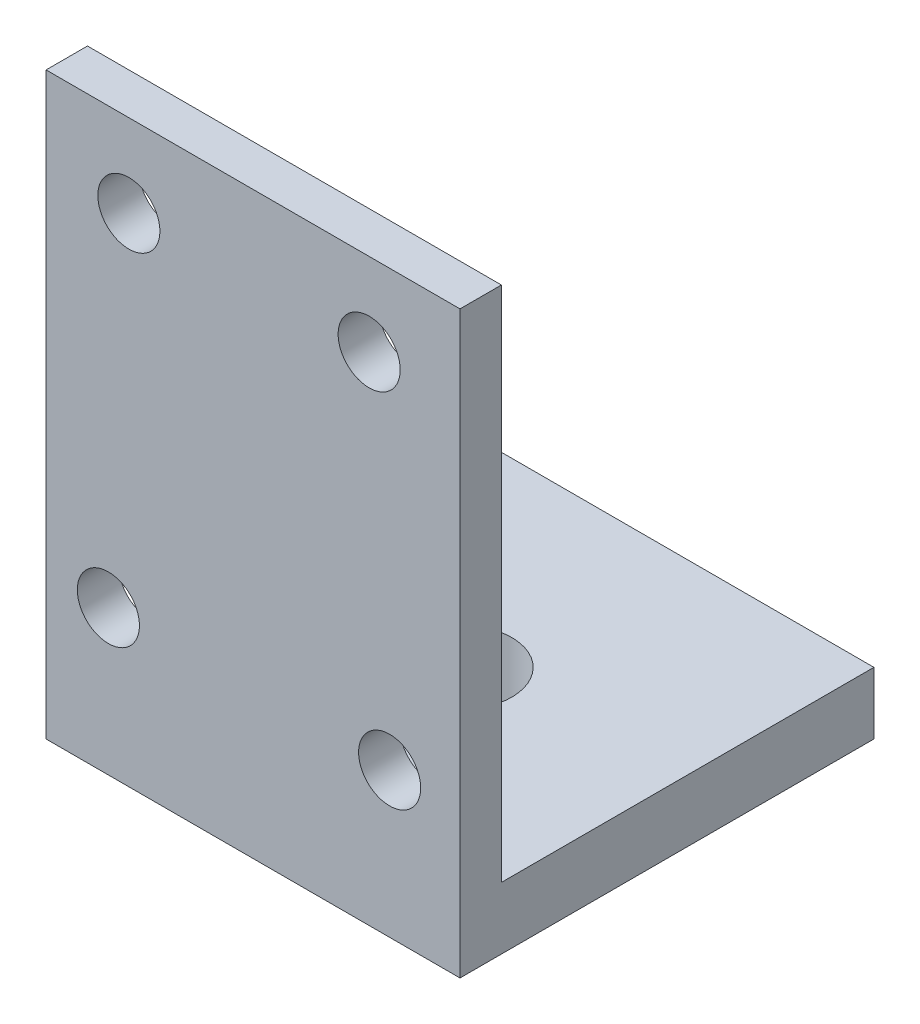
ISO-10303-21;
HEADER;
FILE_DESCRIPTION(('STEP AP214'),'2;1');
FILE_NAME('part.step','',(''),(''),'','','');
FILE_SCHEMA(('AUTOMOTIVE_DESIGN { 1 0 10303 214 1 1 1 1 }'));
ENDSEC;
DATA;
#1=APPLICATION_CONTEXT('core data for automotive mechanical design processes');
#2=APPLICATION_PROTOCOL_DEFINITION('international standard','automotive_design',2000,#1);
#3=PRODUCT_CONTEXT('',#1,'mechanical');
#4=PRODUCT('Part','Part','',(#3));
#5=PRODUCT_RELATED_PRODUCT_CATEGORY('part','',(#4));
#6=PRODUCT_DEFINITION_FORMATION('','',#4);
#7=PRODUCT_DEFINITION_CONTEXT('part definition',#1,'design');
#8=PRODUCT_DEFINITION('design','',#6,#7);
#9=PRODUCT_DEFINITION_SHAPE('','',#8);
#10=(LENGTH_UNIT() NAMED_UNIT(*) SI_UNIT(.MILLI.,.METRE.));
#11=(NAMED_UNIT(*) PLANE_ANGLE_UNIT() SI_UNIT($,.RADIAN.));
#12=(NAMED_UNIT(*) SI_UNIT($,.STERADIAN.) SOLID_ANGLE_UNIT());
#13=UNCERTAINTY_MEASURE_WITH_UNIT(LENGTH_MEASURE(1.E-05),#10,'distance_accuracy_value','');
#14=(GEOMETRIC_REPRESENTATION_CONTEXT(3) GLOBAL_UNCERTAINTY_ASSIGNED_CONTEXT((#13)) GLOBAL_UNIT_ASSIGNED_CONTEXT((#10,
#11,#12)) REPRESENTATION_CONTEXT('',''));
#15=CARTESIAN_POINT('',(0.,0.,0.));
#16=DIRECTION('',(0.,0.,1.));
#17=DIRECTION('',(1.,0.,0.));
#18=AXIS2_PLACEMENT_3D('',#15,#16,#17);
#19=CARTESIAN_POINT('',(0.,3.,0.));
#20=DIRECTION('',(0.,-1.,0.));
#21=DIRECTION('',(0.,0.,-1.));
#22=AXIS2_PLACEMENT_3D('',#19,#20,#21);
#23=PLANE('',#22);
#24=CARTESIAN_POINT('',(10.,3.,-10.));
#25=DIRECTION('',(0.,1.,0.));
#26=DIRECTION('',(0.,0.,1.));
#27=AXIS2_PLACEMENT_3D('',#24,#25,#26);
#28=CIRCLE('',#27,2.5);
#29=CARTESIAN_POINT('',(10.,3.,-7.5));
#30=VERTEX_POINT('',#29);
#31=EDGE_CURVE('E107',#30,#30,#28,.T.);
#32=ORIENTED_EDGE('',*,*,#31,.F.);
#33=EDGE_LOOP('',(#32));
#34=FACE_BOUND('',#33,.T.);
#35=DIRECTION('',(-1.,0.,0.));
#36=VECTOR('',#35,1.);
#37=CARTESIAN_POINT('',(0.,3.,-2.));
#38=LINE('',#37,#36);
#39=CARTESIAN_POINT('',(20.,3.,-2.));
#40=VERTEX_POINT('',#39);
#41=CARTESIAN_POINT('',(0.,3.,-2.));
#42=VERTEX_POINT('',#41);
#43=EDGE_CURVE('E57',#40,#42,#38,.T.);
#44=ORIENTED_EDGE('',*,*,#43,.F.);
#45=DIRECTION('',(0.,0.,-1.));
#46=VECTOR('',#45,1.);
#47=CARTESIAN_POINT('',(20.,3.,0.));
#48=LINE('',#47,#46);
#49=CARTESIAN_POINT('',(20.,3.,-20.));
#50=VERTEX_POINT('',#49);
#51=EDGE_CURVE('E167',#40,#50,#48,.T.);
#52=ORIENTED_EDGE('',*,*,#51,.T.);
#53=DIRECTION('',(-1.,0.,0.));
#54=VECTOR('',#53,1.);
#55=CARTESIAN_POINT('',(0.,3.,-20.));
#56=LINE('',#55,#54);
#57=CARTESIAN_POINT('',(0.,3.,-20.));
#58=VERTEX_POINT('',#57);
#59=EDGE_CURVE('E63',#50,#58,#56,.T.);
#60=ORIENTED_EDGE('',*,*,#59,.T.);
#61=DIRECTION('',(0.,0.,1.));
#62=VECTOR('',#61,1.);
#63=CARTESIAN_POINT('',(0.,3.,0.));
#64=LINE('',#63,#62);
#65=EDGE_CURVE('E93',#58,#42,#64,.T.);
#66=ORIENTED_EDGE('',*,*,#65,.T.);
#67=EDGE_LOOP('',(#44,#52,#60,#66));
#68=FACE_BOUND('',#67,.T.);
#69=ADVANCED_FACE('F39',(#34,#68),#23,.F.);
#70=CARTESIAN_POINT('',(0.,0.,0.));
#71=DIRECTION('',(0.,-1.,0.));
#72=DIRECTION('',(0.,0.,-1.));
#73=AXIS2_PLACEMENT_3D('',#70,#71,#72);
#74=PLANE('',#73);
#75=DIRECTION('',(0.,0.,1.));
#76=VECTOR('',#75,1.);
#77=CARTESIAN_POINT('',(0.,0.,0.));
#78=LINE('',#77,#76);
#79=CARTESIAN_POINT('',(0.,0.,-20.));
#80=VERTEX_POINT('',#79);
#81=CARTESIAN_POINT('',(0.,0.,0.));
#82=VERTEX_POINT('',#81);
#83=EDGE_CURVE('E99',#80,#82,#78,.T.);
#84=ORIENTED_EDGE('',*,*,#83,.F.);
#85=DIRECTION('',(-1.,0.,0.));
#86=VECTOR('',#85,1.);
#87=CARTESIAN_POINT('',(0.,0.,-20.));
#88=LINE('',#87,#86);
#89=CARTESIAN_POINT('',(20.,0.,-20.));
#90=VERTEX_POINT('',#89);
#91=EDGE_CURVE('E82',#90,#80,#88,.T.);
#92=ORIENTED_EDGE('',*,*,#91,.F.);
#93=DIRECTION('',(0.,0.,-1.));
#94=VECTOR('',#93,1.);
#95=CARTESIAN_POINT('',(20.,0.,0.));
#96=LINE('',#95,#94);
#97=CARTESIAN_POINT('',(20.,0.,0.));
#98=VERTEX_POINT('',#97);
#99=EDGE_CURVE('E94',#98,#90,#96,.T.);
#100=ORIENTED_EDGE('',*,*,#99,.F.);
#101=DIRECTION('',(1.,0.,0.));
#102=VECTOR('',#101,1.);
#103=CARTESIAN_POINT('',(0.,0.,0.));
#104=LINE('',#103,#102);
#105=EDGE_CURVE('E105',#82,#98,#104,.T.);
#106=ORIENTED_EDGE('',*,*,#105,.F.);
#107=EDGE_LOOP('',(#84,#92,#100,#106));
#108=FACE_BOUND('',#107,.T.);
#109=CARTESIAN_POINT('',(10.,0.,-10.));
#110=DIRECTION('',(0.,1.,0.));
#111=DIRECTION('',(0.,0.,1.));
#112=AXIS2_PLACEMENT_3D('',#109,#110,#111);
#113=CIRCLE('',#112,2.5);
#114=CARTESIAN_POINT('',(10.,0.,-7.5));
#115=VERTEX_POINT('',#114);
#116=EDGE_CURVE('E113',#115,#115,#113,.T.);
#117=ORIENTED_EDGE('',*,*,#116,.T.);
#118=EDGE_LOOP('',(#117));
#119=FACE_BOUND('',#118,.T.);
#120=ADVANCED_FACE('F103',(#108,#119),#74,.T.);
#121=CARTESIAN_POINT('',(0.,3.,0.));
#122=DIRECTION('',(1.,0.,0.));
#123=DIRECTION('',(0.,0.,-1.));
#124=AXIS2_PLACEMENT_3D('',#121,#122,#123);
#125=PLANE('',#124);
#126=ORIENTED_EDGE('',*,*,#83,.T.);
#127=DIRECTION('',(0.,-1.,0.));
#128=VECTOR('',#127,1.);
#129=CARTESIAN_POINT('',(0.,3.,0.));
#130=LINE('',#129,#128);
#131=CARTESIAN_POINT('',(0.,28.,0.));
#132=VERTEX_POINT('',#131);
#133=EDGE_CURVE('E11',#132,#82,#130,.T.);
#134=ORIENTED_EDGE('',*,*,#133,.F.);
#135=DIRECTION('',(0.,0.,1.));
#136=VECTOR('',#135,1.);
#137=CARTESIAN_POINT('',(0.,28.,0.));
#138=LINE('',#137,#136);
#139=CARTESIAN_POINT('',(0.,28.,-2.));
#140=VERTEX_POINT('',#139);
#141=EDGE_CURVE('E143',#140,#132,#138,.T.);
#142=ORIENTED_EDGE('',*,*,#141,.F.);
#143=DIRECTION('',(0.,-1.,0.));
#144=VECTOR('',#143,1.);
#145=CARTESIAN_POINT('',(0.,28.,-2.));
#146=LINE('',#145,#144);
#147=EDGE_CURVE('E157',#140,#42,#146,.T.);
#148=ORIENTED_EDGE('',*,*,#147,.T.);
#149=ORIENTED_EDGE('',*,*,#65,.F.);
#150=DIRECTION('',(0.,-1.,0.));
#151=VECTOR('',#150,1.);
#152=CARTESIAN_POINT('',(0.,3.,-20.));
#153=LINE('',#152,#151);
#154=EDGE_CURVE('E85',#58,#80,#153,.T.);
#155=ORIENTED_EDGE('',*,*,#154,.T.);
#156=EDGE_LOOP('',(#126,#134,#142,#148,#149,#155));
#157=FACE_BOUND('',#156,.T.);
#158=ADVANCED_FACE('F41',(#157),#125,.F.);
#159=CARTESIAN_POINT('',(0.,3.,0.));
#160=DIRECTION('',(0.,0.,-1.));
#161=DIRECTION('',(-1.,0.,0.));
#162=AXIS2_PLACEMENT_3D('',#159,#160,#161);
#163=PLANE('',#162);
#164=CARTESIAN_POINT('',(15.6101674817246,24.,0.));
#165=DIRECTION('',(0.,0.,1.));
#166=DIRECTION('',(-1.,0.,0.));
#167=AXIS2_PLACEMENT_3D('',#164,#165,#166);
#168=CIRCLE('',#167,1.5);
#169=CARTESIAN_POINT('',(14.1101674817246,24.,0.));
#170=VERTEX_POINT('',#169);
#171=EDGE_CURVE('E197',#170,#170,#168,.T.);
#172=ORIENTED_EDGE('',*,*,#171,.F.);
#173=EDGE_LOOP('',(#172));
#174=FACE_BOUND('',#173,.T.);
#175=CARTESIAN_POINT('',(3.01016748172462,7.,0.));
#176=DIRECTION('',(0.,0.,1.));
#177=DIRECTION('',(-1.,0.,0.));
#178=AXIS2_PLACEMENT_3D('',#175,#176,#177);
#179=CIRCLE('',#178,1.5);
#180=CARTESIAN_POINT('',(1.51016748172462,7.,0.));
#181=VERTEX_POINT('',#180);
#182=EDGE_CURVE('E201',#181,#181,#179,.T.);
#183=ORIENTED_EDGE('',*,*,#182,.F.);
#184=EDGE_LOOP('',(#183));
#185=FACE_BOUND('',#184,.T.);
#186=CARTESIAN_POINT('',(16.6,7.,0.));
#187=DIRECTION('',(0.,0.,1.));
#188=DIRECTION('',(1.,0.,0.));
#189=AXIS2_PLACEMENT_3D('',#186,#187,#188);
#190=CIRCLE('',#189,1.5);
#191=CARTESIAN_POINT('',(18.1,7.,0.));
#192=VERTEX_POINT('',#191);
#193=EDGE_CURVE('E196',#192,#192,#190,.T.);
#194=ORIENTED_EDGE('',*,*,#193,.F.);
#195=EDGE_LOOP('',(#194));
#196=FACE_BOUND('',#195,.T.);
#197=CARTESIAN_POINT('',(4.,24.,0.));
#198=DIRECTION('',(0.,0.,1.));
#199=DIRECTION('',(1.,0.,0.));
#200=AXIS2_PLACEMENT_3D('',#197,#198,#199);
#201=CIRCLE('',#200,1.5);
#202=CARTESIAN_POINT('',(5.5,24.,0.));
#203=VERTEX_POINT('',#202);
#204=EDGE_CURVE('E130',#203,#203,#201,.T.);
#205=ORIENTED_EDGE('',*,*,#204,.F.);
#206=EDGE_LOOP('',(#205));
#207=FACE_BOUND('',#206,.T.);
#208=ORIENTED_EDGE('',*,*,#105,.T.);
#209=DIRECTION('',(0.,-1.,0.));
#210=VECTOR('',#209,1.);
#211=CARTESIAN_POINT('',(20.,3.,0.));
#212=LINE('',#211,#210);
#213=CARTESIAN_POINT('',(20.,28.,0.));
#214=VERTEX_POINT('',#213);
#215=EDGE_CURVE('E49',#214,#98,#212,.T.);
#216=ORIENTED_EDGE('',*,*,#215,.F.);
#217=DIRECTION('',(1.,0.,0.));
#218=VECTOR('',#217,1.);
#219=CARTESIAN_POINT('',(0.,28.,0.));
#220=LINE('',#219,#218);
#221=EDGE_CURVE('E151',#132,#214,#220,.T.);
#222=ORIENTED_EDGE('',*,*,#221,.F.);
#223=ORIENTED_EDGE('',*,*,#133,.T.);
#224=EDGE_LOOP('',(#208,#216,#222,#223));
#225=FACE_BOUND('',#224,.T.);
#226=ADVANCED_FACE('F181',(#174,#185,#196,#207,#225),#163,.F.);
#227=CARTESIAN_POINT('',(20.,3.,0.));
#228=DIRECTION('',(-1.,0.,0.));
#229=DIRECTION('',(0.,0.,1.));
#230=AXIS2_PLACEMENT_3D('',#227,#228,#229);
#231=PLANE('',#230);
#232=ORIENTED_EDGE('',*,*,#99,.T.);
#233=DIRECTION('',(0.,-1.,0.));
#234=VECTOR('',#233,1.);
#235=CARTESIAN_POINT('',(20.,3.,-20.));
#236=LINE('',#235,#234);
#237=EDGE_CURVE('E88',#50,#90,#236,.T.);
#238=ORIENTED_EDGE('',*,*,#237,.F.);
#239=ORIENTED_EDGE('',*,*,#51,.F.);
#240=DIRECTION('',(0.,-1.,0.));
#241=VECTOR('',#240,1.);
#242=CARTESIAN_POINT('',(20.,28.,-2.));
#243=LINE('',#242,#241);
#244=CARTESIAN_POINT('',(20.,28.,-2.));
#245=VERTEX_POINT('',#244);
#246=EDGE_CURVE('E160',#245,#40,#243,.T.);
#247=ORIENTED_EDGE('',*,*,#246,.F.);
#248=DIRECTION('',(0.,0.,-1.));
#249=VECTOR('',#248,1.);
#250=CARTESIAN_POINT('',(20.,28.,0.));
#251=LINE('',#250,#249);
#252=EDGE_CURVE('E177',#214,#245,#251,.T.);
#253=ORIENTED_EDGE('',*,*,#252,.F.);
#254=ORIENTED_EDGE('',*,*,#215,.T.);
#255=EDGE_LOOP('',(#232,#238,#239,#247,#253,#254));
#256=FACE_BOUND('',#255,.T.);
#257=ADVANCED_FACE('F172',(#256),#231,.F.);
#258=CARTESIAN_POINT('',(0.,3.,-20.));
#259=DIRECTION('',(0.,0.,1.));
#260=DIRECTION('',(1.,0.,0.));
#261=AXIS2_PLACEMENT_3D('',#258,#259,#260);
#262=PLANE('',#261);
#263=ORIENTED_EDGE('',*,*,#91,.T.);
#264=ORIENTED_EDGE('',*,*,#154,.F.);
#265=ORIENTED_EDGE('',*,*,#59,.F.);
#266=ORIENTED_EDGE('',*,*,#237,.T.);
#267=EDGE_LOOP('',(#263,#264,#265,#266));
#268=FACE_BOUND('',#267,.T.);
#269=ADVANCED_FACE('F84',(#268),#262,.F.);
#270=CARTESIAN_POINT('',(10.,3.,-10.));
#271=DIRECTION('',(0.,-1.,0.));
#272=DIRECTION('',(0.,0.,-1.));
#273=AXIS2_PLACEMENT_3D('',#270,#271,#272);
#274=CYLINDRICAL_SURFACE('',#273,2.5);
#275=ORIENTED_EDGE('',*,*,#31,.T.);
#276=EDGE_LOOP('',(#275));
#277=FACE_BOUND('',#276,.T.);
#278=ORIENTED_EDGE('',*,*,#116,.F.);
#279=EDGE_LOOP('',(#278));
#280=FACE_BOUND('',#279,.T.);
#281=ADVANCED_FACE('F225',(#277,#280),#274,.F.);
#282=CARTESIAN_POINT('',(0.,28.,-2.));
#283=DIRECTION('',(0.,0.,1.));
#284=DIRECTION('',(1.,0.,0.));
#285=AXIS2_PLACEMENT_3D('',#282,#283,#284);
#286=PLANE('',#285);
#287=CARTESIAN_POINT('',(15.6101674817246,24.,-2.));
#288=DIRECTION('',(0.,0.,1.));
#289=DIRECTION('',(1.,0.,0.));
#290=AXIS2_PLACEMENT_3D('',#287,#288,#289);
#291=CIRCLE('',#290,1.5);
#292=CARTESIAN_POINT('',(17.1101674817246,24.,-2.));
#293=VERTEX_POINT('',#292);
#294=EDGE_CURVE('E43',#293,#293,#291,.T.);
#295=ORIENTED_EDGE('',*,*,#294,.T.);
#296=EDGE_LOOP('',(#295));
#297=FACE_BOUND('',#296,.T.);
#298=CARTESIAN_POINT('',(3.01016748172462,7.,-2.));
#299=DIRECTION('',(0.,0.,1.));
#300=DIRECTION('',(1.,0.,0.));
#301=AXIS2_PLACEMENT_3D('',#298,#299,#300);
#302=CIRCLE('',#301,1.5);
#303=CARTESIAN_POINT('',(4.51016748172461,7.,-2.));
#304=VERTEX_POINT('',#303);
#305=EDGE_CURVE('E133',#304,#304,#302,.T.);
#306=ORIENTED_EDGE('',*,*,#305,.T.);
#307=EDGE_LOOP('',(#306));
#308=FACE_BOUND('',#307,.T.);
#309=CARTESIAN_POINT('',(16.6,7.,-2.));
#310=DIRECTION('',(0.,0.,1.));
#311=DIRECTION('',(1.,0.,0.));
#312=AXIS2_PLACEMENT_3D('',#309,#310,#311);
#313=CIRCLE('',#312,1.5);
#314=CARTESIAN_POINT('',(18.1,7.,-2.));
#315=VERTEX_POINT('',#314);
#316=EDGE_CURVE('E129',#315,#315,#313,.T.);
#317=ORIENTED_EDGE('',*,*,#316,.T.);
#318=EDGE_LOOP('',(#317));
#319=FACE_BOUND('',#318,.T.);
#320=CARTESIAN_POINT('',(4.,24.,-2.));
#321=DIRECTION('',(0.,0.,1.));
#322=DIRECTION('',(1.,0.,0.));
#323=AXIS2_PLACEMENT_3D('',#320,#321,#322);
#324=CIRCLE('',#323,1.5);
#325=CARTESIAN_POINT('',(5.5,24.,-2.));
#326=VERTEX_POINT('',#325);
#327=EDGE_CURVE('E125',#326,#326,#324,.T.);
#328=ORIENTED_EDGE('',*,*,#327,.T.);
#329=EDGE_LOOP('',(#328));
#330=FACE_BOUND('',#329,.T.);
#331=ORIENTED_EDGE('',*,*,#43,.T.);
#332=ORIENTED_EDGE('',*,*,#147,.F.);
#333=DIRECTION('',(-1.,0.,0.));
#334=VECTOR('',#333,1.);
#335=CARTESIAN_POINT('',(0.,28.,-2.));
#336=LINE('',#335,#334);
#337=EDGE_CURVE('E155',#245,#140,#336,.T.);
#338=ORIENTED_EDGE('',*,*,#337,.F.);
#339=ORIENTED_EDGE('',*,*,#246,.T.);
#340=EDGE_LOOP('',(#331,#332,#338,#339));
#341=FACE_BOUND('',#340,.T.);
#342=ADVANCED_FACE('F223',(#297,#308,#319,#330,#341),#286,.F.);
#343=CARTESIAN_POINT('',(0.,28.,0.));
#344=DIRECTION('',(0.,-1.,0.));
#345=DIRECTION('',(0.,0.,-1.));
#346=AXIS2_PLACEMENT_3D('',#343,#344,#345);
#347=PLANE('',#346);
#348=ORIENTED_EDGE('',*,*,#141,.T.);
#349=ORIENTED_EDGE('',*,*,#221,.T.);
#350=ORIENTED_EDGE('',*,*,#252,.T.);
#351=ORIENTED_EDGE('',*,*,#337,.T.);
#352=EDGE_LOOP('',(#348,#349,#350,#351));
#353=FACE_BOUND('',#352,.T.);
#354=ADVANCED_FACE('F186',(#353),#347,.F.);
#355=CARTESIAN_POINT('',(4.,24.,-25.));
#356=DIRECTION('',(0.,0.,1.));
#357=DIRECTION('',(1.,0.,0.));
#358=AXIS2_PLACEMENT_3D('',#355,#356,#357);
#359=CYLINDRICAL_SURFACE('',#358,1.5);
#360=ORIENTED_EDGE('',*,*,#204,.T.);
#361=EDGE_LOOP('',(#360));
#362=FACE_BOUND('',#361,.T.);
#363=ORIENTED_EDGE('',*,*,#327,.F.);
#364=EDGE_LOOP('',(#363));
#365=FACE_BOUND('',#364,.T.);
#366=ADVANCED_FACE('F217',(#362,#365),#359,.F.);
#367=CARTESIAN_POINT('',(16.6,7.,-25.));
#368=DIRECTION('',(0.,0.,1.));
#369=DIRECTION('',(1.,0.,0.));
#370=AXIS2_PLACEMENT_3D('',#367,#368,#369);
#371=CYLINDRICAL_SURFACE('',#370,1.5);
#372=ORIENTED_EDGE('',*,*,#193,.T.);
#373=EDGE_LOOP('',(#372));
#374=FACE_BOUND('',#373,.T.);
#375=ORIENTED_EDGE('',*,*,#316,.F.);
#376=EDGE_LOOP('',(#375));
#377=FACE_BOUND('',#376,.T.);
#378=ADVANCED_FACE('F209',(#374,#377),#371,.F.);
#379=CARTESIAN_POINT('',(3.01016748172462,7.,-25.));
#380=DIRECTION('',(0.,0.,1.));
#381=DIRECTION('',(1.,0.,0.));
#382=AXIS2_PLACEMENT_3D('',#379,#380,#381);
#383=CYLINDRICAL_SURFACE('',#382,1.5);
#384=ORIENTED_EDGE('',*,*,#182,.T.);
#385=EDGE_LOOP('',(#384));
#386=FACE_BOUND('',#385,.T.);
#387=ORIENTED_EDGE('',*,*,#305,.F.);
#388=EDGE_LOOP('',(#387));
#389=FACE_BOUND('',#388,.T.);
#390=ADVANCED_FACE('F315',(#386,#389),#383,.F.);
#391=CARTESIAN_POINT('',(15.6101674817246,24.,-25.));
#392=DIRECTION('',(0.,0.,1.));
#393=DIRECTION('',(1.,0.,0.));
#394=AXIS2_PLACEMENT_3D('',#391,#392,#393);
#395=CYLINDRICAL_SURFACE('',#394,1.5);
#396=ORIENTED_EDGE('',*,*,#171,.T.);
#397=EDGE_LOOP('',(#396));
#398=FACE_BOUND('',#397,.T.);
#399=ORIENTED_EDGE('',*,*,#294,.F.);
#400=EDGE_LOOP('',(#399));
#401=FACE_BOUND('',#400,.T.);
#402=ADVANCED_FACE('F323',(#398,#401),#395,.F.);
#403=CLOSED_SHELL('',(#69,#120,#158,#226,#257,#269,#281,#342,#354,#366,#378,#390,#402));
#404=MANIFOLD_SOLID_BREP('B2',#403);
#405=ADVANCED_BREP_SHAPE_REPRESENTATION('',(#18,#404),#14);
#406=SHAPE_DEFINITION_REPRESENTATION(#9,#405);
ENDSEC;
END-ISO-10303-21;
